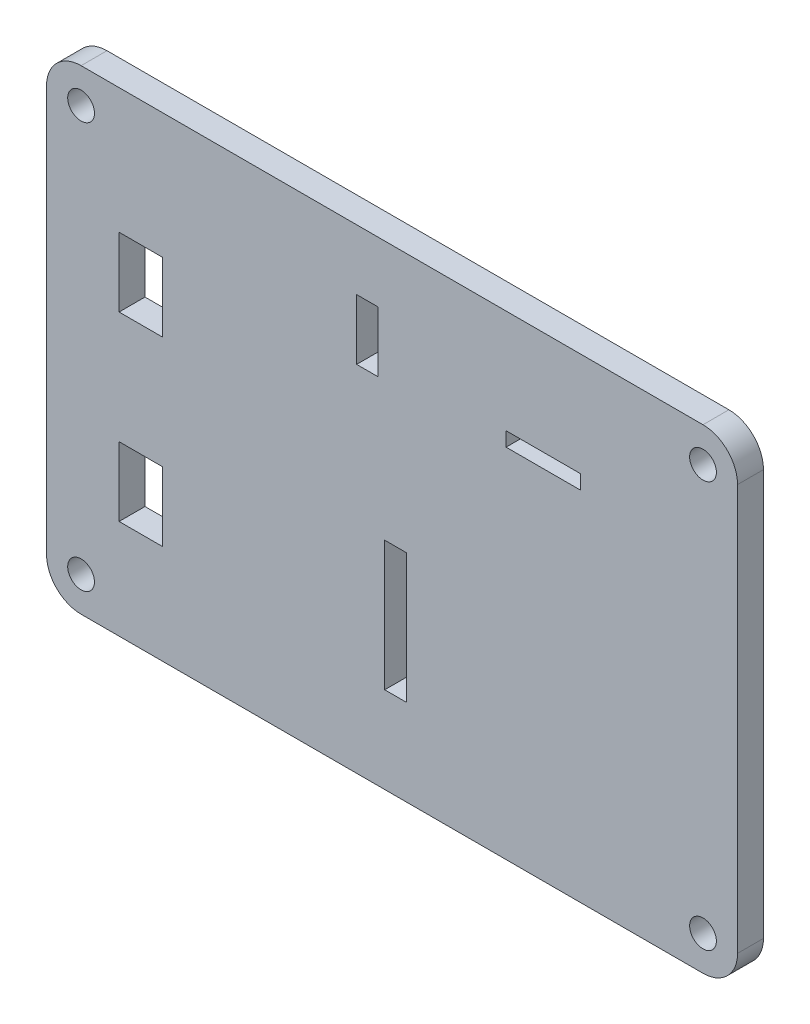
ISO-10303-21;
HEADER;
FILE_DESCRIPTION(('STEP AP214'),'2;1');
FILE_NAME('part.step','',(''),(''),'','','');
FILE_SCHEMA(('AUTOMOTIVE_DESIGN { 1 0 10303 214 1 1 1 1 }'));
ENDSEC;
DATA;
#1=APPLICATION_CONTEXT('core data for automotive mechanical design processes');
#2=APPLICATION_PROTOCOL_DEFINITION('international standard','automotive_design',2000,#1);
#3=PRODUCT_CONTEXT('',#1,'mechanical');
#4=PRODUCT('Part','Part','',(#3));
#5=PRODUCT_RELATED_PRODUCT_CATEGORY('part','',(#4));
#6=PRODUCT_DEFINITION_FORMATION('','',#4);
#7=PRODUCT_DEFINITION_CONTEXT('part definition',#1,'design');
#8=PRODUCT_DEFINITION('design','',#6,#7);
#9=PRODUCT_DEFINITION_SHAPE('','',#8);
#10=(LENGTH_UNIT() NAMED_UNIT(*) SI_UNIT(.MILLI.,.METRE.));
#11=(NAMED_UNIT(*) PLANE_ANGLE_UNIT() SI_UNIT($,.RADIAN.));
#12=(NAMED_UNIT(*) SI_UNIT($,.STERADIAN.) SOLID_ANGLE_UNIT());
#13=UNCERTAINTY_MEASURE_WITH_UNIT(LENGTH_MEASURE(1.E-05),#10,'distance_accuracy_value','');
#14=(GEOMETRIC_REPRESENTATION_CONTEXT(3) GLOBAL_UNCERTAINTY_ASSIGNED_CONTEXT((#13)) GLOBAL_UNIT_ASSIGNED_CONTEXT((#10,
#11,#12)) REPRESENTATION_CONTEXT('',''));
#15=CARTESIAN_POINT('',(0.,0.,0.));
#16=DIRECTION('',(0.,0.,1.));
#17=DIRECTION('',(1.,0.,0.));
#18=AXIS2_PLACEMENT_3D('',#15,#16,#17);
#19=CARTESIAN_POINT('',(-36.,23.5,3.));
#20=DIRECTION('',(0.,0.,1.));
#21=DIRECTION('',(1.,0.,0.));
#22=AXIS2_PLACEMENT_3D('',#19,#20,#21);
#23=PLANE('',#22);
#24=CARTESIAN_POINT('',(36.,-23.5,3.));
#25=DIRECTION('',(0.,0.,1.));
#26=DIRECTION('',(1.,0.,0.));
#27=AXIS2_PLACEMENT_3D('',#24,#25,#26);
#28=CIRCLE('',#27,1.54999999999994);
#29=CARTESIAN_POINT('',(37.55,-23.5,3.));
#30=VERTEX_POINT('',#29);
#31=EDGE_CURVE('E384',#30,#30,#28,.T.);
#32=ORIENTED_EDGE('',*,*,#31,.F.);
#33=EDGE_LOOP('',(#32));
#34=FACE_BOUND('',#33,.T.);
#35=CARTESIAN_POINT('',(-36.,23.5,3.));
#36=DIRECTION('',(0.,0.,1.));
#37=DIRECTION('',(1.,0.,0.));
#38=AXIS2_PLACEMENT_3D('',#35,#36,#37);
#39=CIRCLE('',#38,1.54999999999994);
#40=CARTESIAN_POINT('',(-34.4500000000001,23.5,3.));
#41=VERTEX_POINT('',#40);
#42=EDGE_CURVE('E396',#41,#41,#39,.T.);
#43=ORIENTED_EDGE('',*,*,#42,.F.);
#44=EDGE_LOOP('',(#43));
#45=FACE_BOUND('',#44,.T.);
#46=CARTESIAN_POINT('',(-36.,23.5,3.));
#47=DIRECTION('',(0.,0.,1.));
#48=DIRECTION('',(1.,0.,0.));
#49=AXIS2_PLACEMENT_3D('',#46,#47,#48);
#50=CIRCLE('',#49,4.);
#51=CARTESIAN_POINT('',(-36.,27.5,3.));
#52=VERTEX_POINT('',#51);
#53=CARTESIAN_POINT('',(-40.,23.5,3.));
#54=VERTEX_POINT('',#53);
#55=EDGE_CURVE('E402',#52,#54,#50,.T.);
#56=ORIENTED_EDGE('',*,*,#55,.T.);
#57=DIRECTION('',(0.,-1.,0.));
#58=VECTOR('',#57,1.);
#59=CARTESIAN_POINT('',(-40.,23.5,3.));
#60=LINE('',#59,#58);
#61=CARTESIAN_POINT('',(-40.,-23.5,3.));
#62=VERTEX_POINT('',#61);
#63=EDGE_CURVE('E405',#54,#62,#60,.T.);
#64=ORIENTED_EDGE('',*,*,#63,.T.);
#65=CARTESIAN_POINT('',(-36.,-23.5,3.));
#66=DIRECTION('',(0.,0.,1.));
#67=DIRECTION('',(1.,0.,0.));
#68=AXIS2_PLACEMENT_3D('',#65,#66,#67);
#69=CIRCLE('',#68,4.);
#70=CARTESIAN_POINT('',(-36.,-27.5,3.));
#71=VERTEX_POINT('',#70);
#72=EDGE_CURVE('E408',#62,#71,#69,.T.);
#73=ORIENTED_EDGE('',*,*,#72,.T.);
#74=DIRECTION('',(1.,0.,0.));
#75=VECTOR('',#74,1.);
#76=CARTESIAN_POINT('',(-36.,-27.5,3.));
#77=LINE('',#76,#75);
#78=CARTESIAN_POINT('',(36.,-27.5,3.));
#79=VERTEX_POINT('',#78);
#80=EDGE_CURVE('E410',#71,#79,#77,.T.);
#81=ORIENTED_EDGE('',*,*,#80,.T.);
#82=CARTESIAN_POINT('',(36.,-23.5,3.));
#83=DIRECTION('',(0.,0.,1.));
#84=DIRECTION('',(1.,0.,0.));
#85=AXIS2_PLACEMENT_3D('',#82,#83,#84);
#86=CIRCLE('',#85,4.00000000000001);
#87=CARTESIAN_POINT('',(40.,-23.5,3.));
#88=VERTEX_POINT('',#87);
#89=EDGE_CURVE('E412',#79,#88,#86,.T.);
#90=ORIENTED_EDGE('',*,*,#89,.T.);
#91=DIRECTION('',(0.,1.,0.));
#92=VECTOR('',#91,1.);
#93=CARTESIAN_POINT('',(40.,-23.5,3.));
#94=LINE('',#93,#92);
#95=CARTESIAN_POINT('',(40.,23.5,3.));
#96=VERTEX_POINT('',#95);
#97=EDGE_CURVE('E414',#88,#96,#94,.T.);
#98=ORIENTED_EDGE('',*,*,#97,.T.);
#99=CARTESIAN_POINT('',(36.,23.5,3.));
#100=DIRECTION('',(0.,0.,1.));
#101=DIRECTION('',(1.,0.,0.));
#102=AXIS2_PLACEMENT_3D('',#99,#100,#101);
#103=CIRCLE('',#102,4.);
#104=CARTESIAN_POINT('',(36.,27.5,3.));
#105=VERTEX_POINT('',#104);
#106=EDGE_CURVE('E416',#96,#105,#103,.T.);
#107=ORIENTED_EDGE('',*,*,#106,.T.);
#108=DIRECTION('',(-1.,0.,0.));
#109=VECTOR('',#108,1.);
#110=CARTESIAN_POINT('',(36.,27.5,3.));
#111=LINE('',#110,#109);
#112=EDGE_CURVE('E418',#105,#52,#111,.T.);
#113=ORIENTED_EDGE('',*,*,#112,.T.);
#114=EDGE_LOOP('',(#56,#64,#73,#81,#90,#98,#107,#113));
#115=FACE_BOUND('',#114,.T.);
#116=CARTESIAN_POINT('',(-36.,-23.5,3.));
#117=DIRECTION('',(0.,0.,1.));
#118=DIRECTION('',(1.,0.,0.));
#119=AXIS2_PLACEMENT_3D('',#116,#117,#118);
#120=CIRCLE('',#119,1.54999999999994);
#121=CARTESIAN_POINT('',(-34.4500000000001,-23.5,3.));
#122=VERTEX_POINT('',#121);
#123=EDGE_CURVE('E390',#122,#122,#120,.T.);
#124=ORIENTED_EDGE('',*,*,#123,.F.);
#125=EDGE_LOOP('',(#124));
#126=FACE_BOUND('',#125,.T.);
#127=CARTESIAN_POINT('',(36.,23.5,3.));
#128=DIRECTION('',(0.,0.,1.));
#129=DIRECTION('',(1.,0.,0.));
#130=AXIS2_PLACEMENT_3D('',#127,#128,#129);
#131=CIRCLE('',#130,1.54999999999994);
#132=CARTESIAN_POINT('',(37.55,23.5,3.));
#133=VERTEX_POINT('',#132);
#134=EDGE_CURVE('E378',#133,#133,#131,.T.);
#135=ORIENTED_EDGE('',*,*,#134,.F.);
#136=EDGE_LOOP('',(#135));
#137=FACE_BOUND('',#136,.T.);
#138=DIRECTION('',(-1.,0.,0.));
#139=VECTOR('',#138,1.);
#140=CARTESIAN_POINT('',(-26.6,-8.00000000000001,3.));
#141=LINE('',#140,#139);
#142=CARTESIAN_POINT('',(-26.6,-8.00000000000001,3.));
#143=VERTEX_POINT('',#142);
#144=CARTESIAN_POINT('',(-31.599999999999,-8.00000000000001,3.));
#145=VERTEX_POINT('',#144);
#146=EDGE_CURVE('E349',#143,#145,#141,.T.);
#147=ORIENTED_EDGE('',*,*,#146,.F.);
#148=DIRECTION('',(0.,1.,0.));
#149=VECTOR('',#148,1.);
#150=CARTESIAN_POINT('',(-26.6,-16.,3.));
#151=LINE('',#150,#149);
#152=CARTESIAN_POINT('',(-26.6,-16.,3.));
#153=VERTEX_POINT('',#152);
#154=EDGE_CURVE('E347',#153,#143,#151,.T.);
#155=ORIENTED_EDGE('',*,*,#154,.F.);
#156=DIRECTION('',(1.,0.,0.));
#157=VECTOR('',#156,1.);
#158=CARTESIAN_POINT('',(-31.599999999999,-16.,3.));
#159=LINE('',#158,#157);
#160=CARTESIAN_POINT('',(-31.599999999999,-16.,3.));
#161=VERTEX_POINT('',#160);
#162=EDGE_CURVE('E355',#161,#153,#159,.T.);
#163=ORIENTED_EDGE('',*,*,#162,.F.);
#164=DIRECTION('',(0.,-1.,0.));
#165=VECTOR('',#164,1.);
#166=CARTESIAN_POINT('',(-31.599999999999,-8.00000000000001,3.));
#167=LINE('',#166,#165);
#168=EDGE_CURVE('E352',#145,#161,#167,.T.);
#169=ORIENTED_EDGE('',*,*,#168,.F.);
#170=EDGE_LOOP('',(#147,#155,#163,#169));
#171=FACE_BOUND('',#170,.T.);
#172=DIRECTION('',(0.,1.,0.));
#173=VECTOR('',#172,1.);
#174=CARTESIAN_POINT('',(-26.6,5.,3.));
#175=LINE('',#174,#173);
#176=CARTESIAN_POINT('',(-26.6,5.,3.));
#177=VERTEX_POINT('',#176);
#178=CARTESIAN_POINT('',(-26.6,13.,3.));
#179=VERTEX_POINT('',#178);
#180=EDGE_CURVE('E318',#177,#179,#175,.T.);
#181=ORIENTED_EDGE('',*,*,#180,.F.);
#182=DIRECTION('',(1.,0.,0.));
#183=VECTOR('',#182,1.);
#184=CARTESIAN_POINT('',(-31.599999999999,5.,3.));
#185=LINE('',#184,#183);
#186=CARTESIAN_POINT('',(-31.599999999999,5.,3.));
#187=VERTEX_POINT('',#186);
#188=EDGE_CURVE('E316',#187,#177,#185,.T.);
#189=ORIENTED_EDGE('',*,*,#188,.F.);
#190=DIRECTION('',(0.,-1.,0.));
#191=VECTOR('',#190,1.);
#192=CARTESIAN_POINT('',(-31.599999999999,13.,3.));
#193=LINE('',#192,#191);
#194=CARTESIAN_POINT('',(-31.599999999999,13.,3.));
#195=VERTEX_POINT('',#194);
#196=EDGE_CURVE('E324',#195,#187,#193,.T.);
#197=ORIENTED_EDGE('',*,*,#196,.F.);
#198=DIRECTION('',(-1.,0.,0.));
#199=VECTOR('',#198,1.);
#200=CARTESIAN_POINT('',(-26.6,13.,3.));
#201=LINE('',#200,#199);
#202=EDGE_CURVE('E321',#179,#195,#201,.T.);
#203=ORIENTED_EDGE('',*,*,#202,.F.);
#204=EDGE_LOOP('',(#181,#189,#197,#203));
#205=FACE_BOUND('',#204,.T.);
#206=DIRECTION('',(0.,1.,0.));
#207=VECTOR('',#206,1.);
#208=CARTESIAN_POINT('',(1.65000000000015,-17.5,3.));
#209=LINE('',#208,#207);
#210=CARTESIAN_POINT('',(1.65000000000015,-17.5,3.));
#211=VERTEX_POINT('',#210);
#212=CARTESIAN_POINT('',(1.65000000000015,-2.50000000000006,3.));
#213=VERTEX_POINT('',#212);
#214=EDGE_CURVE('E287',#211,#213,#209,.T.);
#215=ORIENTED_EDGE('',*,*,#214,.F.);
#216=DIRECTION('',(1.,0.,0.));
#217=VECTOR('',#216,1.);
#218=CARTESIAN_POINT('',(-0.850000000000017,-17.5,3.));
#219=LINE('',#218,#217);
#220=CARTESIAN_POINT('',(-0.850000000000017,-17.5,3.));
#221=VERTEX_POINT('',#220);
#222=EDGE_CURVE('E285',#221,#211,#219,.T.);
#223=ORIENTED_EDGE('',*,*,#222,.F.);
#224=DIRECTION('',(0.,-1.,0.));
#225=VECTOR('',#224,1.);
#226=CARTESIAN_POINT('',(-0.850000000000019,-2.50000000000006,3.));
#227=LINE('',#226,#225);
#228=CARTESIAN_POINT('',(-0.850000000000014,-2.50000000000006,3.));
#229=VERTEX_POINT('',#228);
#230=EDGE_CURVE('E293',#229,#221,#227,.T.);
#231=ORIENTED_EDGE('',*,*,#230,.F.);
#232=DIRECTION('',(-1.,0.,0.));
#233=VECTOR('',#232,1.);
#234=CARTESIAN_POINT('',(1.65000000000015,-2.50000000000006,3.));
#235=LINE('',#234,#233);
#236=EDGE_CURVE('E290',#213,#229,#235,.T.);
#237=ORIENTED_EDGE('',*,*,#236,.F.);
#238=EDGE_LOOP('',(#215,#223,#231,#237));
#239=FACE_BOUND('',#238,.T.);
#240=DIRECTION('',(0.,1.,0.));
#241=VECTOR('',#240,1.);
#242=CARTESIAN_POINT('',(-1.60000000000005,13.5,3.));
#243=LINE('',#242,#241);
#244=CARTESIAN_POINT('',(-1.60000000000005,13.5,3.));
#245=VERTEX_POINT('',#244);
#246=CARTESIAN_POINT('',(-1.60000000000005,20.5,3.));
#247=VERTEX_POINT('',#246);
#248=EDGE_CURVE('E256',#245,#247,#243,.T.);
#249=ORIENTED_EDGE('',*,*,#248,.F.);
#250=DIRECTION('',(1.,0.,0.));
#251=VECTOR('',#250,1.);
#252=CARTESIAN_POINT('',(-4.09999999999999,13.5,3.));
#253=LINE('',#252,#251);
#254=CARTESIAN_POINT('',(-4.09999999999999,13.5,3.));
#255=VERTEX_POINT('',#254);
#256=EDGE_CURVE('E254',#255,#245,#253,.T.);
#257=ORIENTED_EDGE('',*,*,#256,.F.);
#258=DIRECTION('',(0.,-1.,0.));
#259=VECTOR('',#258,1.);
#260=CARTESIAN_POINT('',(-4.09999999999999,20.5,3.));
#261=LINE('',#260,#259);
#262=CARTESIAN_POINT('',(-4.09999999999999,20.5,3.));
#263=VERTEX_POINT('',#262);
#264=EDGE_CURVE('E262',#263,#255,#261,.T.);
#265=ORIENTED_EDGE('',*,*,#264,.F.);
#266=DIRECTION('',(-1.,0.,0.));
#267=VECTOR('',#266,1.);
#268=CARTESIAN_POINT('',(-1.60000000000005,20.5,3.));
#269=LINE('',#268,#267);
#270=EDGE_CURVE('E259',#247,#263,#269,.T.);
#271=ORIENTED_EDGE('',*,*,#270,.F.);
#272=EDGE_LOOP('',(#249,#257,#265,#271));
#273=FACE_BOUND('',#272,.T.);
#274=DIRECTION('',(-1.,0.,0.));
#275=VECTOR('',#274,1.);
#276=CARTESIAN_POINT('',(21.7999999999998,15.4999999999998,3.));
#277=LINE('',#276,#275);
#278=CARTESIAN_POINT('',(21.7999999999998,15.4999999999998,3.));
#279=VERTEX_POINT('',#278);
#280=CARTESIAN_POINT('',(13.2000000000001,15.4999999999998,3.));
#281=VERTEX_POINT('',#280);
#282=EDGE_CURVE('E226',#279,#281,#277,.T.);
#283=ORIENTED_EDGE('',*,*,#282,.F.);
#284=DIRECTION('',(0.,1.,0.));
#285=VECTOR('',#284,1.);
#286=CARTESIAN_POINT('',(21.7999999999998,13.85,3.));
#287=LINE('',#286,#285);
#288=CARTESIAN_POINT('',(21.7999999999998,13.85,3.));
#289=VERTEX_POINT('',#288);
#290=EDGE_CURVE('E218',#289,#279,#287,.T.);
#291=ORIENTED_EDGE('',*,*,#290,.F.);
#292=DIRECTION('',(1.,0.,0.));
#293=VECTOR('',#292,1.);
#294=CARTESIAN_POINT('',(13.1999999999999,13.85,3.));
#295=LINE('',#294,#293);
#296=CARTESIAN_POINT('',(13.1999999999999,13.85,3.));
#297=VERTEX_POINT('',#296);
#298=EDGE_CURVE('E240',#297,#289,#295,.T.);
#299=ORIENTED_EDGE('',*,*,#298,.F.);
#300=DIRECTION('',(-1.34572487833367E-13,-1.,0.));
#301=VECTOR('',#300,1.);
#302=CARTESIAN_POINT('',(13.2000000000001,15.4999999999998,3.));
#303=LINE('',#302,#301);
#304=EDGE_CURVE('E238',#281,#297,#303,.T.);
#305=ORIENTED_EDGE('',*,*,#304,.F.);
#306=EDGE_LOOP('',(#283,#291,#299,#305));
#307=FACE_BOUND('',#306,.T.);
#308=ADVANCED_FACE('F33',(#34,#45,#115,#126,#137,#171,#205,#239,#273,#307),#23,.T.);
#309=CARTESIAN_POINT('',(-36.,23.5,0.));
#310=DIRECTION('',(0.,0.,1.));
#311=DIRECTION('',(1.,0.,0.));
#312=AXIS2_PLACEMENT_3D('',#309,#310,#311);
#313=PLANE('',#312);
#314=DIRECTION('',(1.,0.,0.));
#315=VECTOR('',#314,1.);
#316=CARTESIAN_POINT('',(-4.09999999999999,13.5,0.));
#317=LINE('',#316,#315);
#318=CARTESIAN_POINT('',(-4.09999999999999,13.5,0.));
#319=VERTEX_POINT('',#318);
#320=CARTESIAN_POINT('',(-1.60000000000005,13.5,0.));
#321=VERTEX_POINT('',#320);
#322=EDGE_CURVE('E234',#319,#321,#317,.T.);
#323=ORIENTED_EDGE('',*,*,#322,.T.);
#324=DIRECTION('',(0.,1.,0.));
#325=VECTOR('',#324,1.);
#326=CARTESIAN_POINT('',(-1.60000000000005,13.5,0.));
#327=LINE('',#326,#325);
#328=CARTESIAN_POINT('',(-1.60000000000005,20.5,0.));
#329=VERTEX_POINT('',#328);
#330=EDGE_CURVE('E267',#321,#329,#327,.T.);
#331=ORIENTED_EDGE('',*,*,#330,.T.);
#332=DIRECTION('',(-1.,0.,0.));
#333=VECTOR('',#332,1.);
#334=CARTESIAN_POINT('',(-1.60000000000005,20.5,0.));
#335=LINE('',#334,#333);
#336=CARTESIAN_POINT('',(-4.09999999999999,20.5,0.));
#337=VERTEX_POINT('',#336);
#338=EDGE_CURVE('E270',#329,#337,#335,.T.);
#339=ORIENTED_EDGE('',*,*,#338,.T.);
#340=DIRECTION('',(0.,-1.,0.));
#341=VECTOR('',#340,1.);
#342=CARTESIAN_POINT('',(-4.09999999999999,20.5,0.));
#343=LINE('',#342,#341);
#344=EDGE_CURVE('E257',#337,#319,#343,.T.);
#345=ORIENTED_EDGE('',*,*,#344,.T.);
#346=EDGE_LOOP('',(#323,#331,#339,#345));
#347=FACE_BOUND('',#346,.T.);
#348=DIRECTION('',(1.,0.,0.));
#349=VECTOR('',#348,1.);
#350=CARTESIAN_POINT('',(-31.599999999999,5.,0.));
#351=LINE('',#350,#349);
#352=CARTESIAN_POINT('',(-31.599999999999,5.,0.));
#353=VERTEX_POINT('',#352);
#354=CARTESIAN_POINT('',(-26.6,5.,0.));
#355=VERTEX_POINT('',#354);
#356=EDGE_CURVE('E315',#353,#355,#351,.T.);
#357=ORIENTED_EDGE('',*,*,#356,.T.);
#358=DIRECTION('',(0.,1.,0.));
#359=VECTOR('',#358,1.);
#360=CARTESIAN_POINT('',(-26.6,5.,0.));
#361=LINE('',#360,#359);
#362=CARTESIAN_POINT('',(-26.6,13.,0.));
#363=VERTEX_POINT('',#362);
#364=EDGE_CURVE('E329',#355,#363,#361,.T.);
#365=ORIENTED_EDGE('',*,*,#364,.T.);
#366=DIRECTION('',(-1.,0.,0.));
#367=VECTOR('',#366,1.);
#368=CARTESIAN_POINT('',(-26.6,13.,0.));
#369=LINE('',#368,#367);
#370=CARTESIAN_POINT('',(-31.599999999999,13.,0.));
#371=VERTEX_POINT('',#370);
#372=EDGE_CURVE('E332',#363,#371,#369,.T.);
#373=ORIENTED_EDGE('',*,*,#372,.T.);
#374=DIRECTION('',(0.,-1.,0.));
#375=VECTOR('',#374,1.);
#376=CARTESIAN_POINT('',(-31.599999999999,13.,0.));
#377=LINE('',#376,#375);
#378=EDGE_CURVE('E319',#371,#353,#377,.T.);
#379=ORIENTED_EDGE('',*,*,#378,.T.);
#380=EDGE_LOOP('',(#357,#365,#373,#379));
#381=FACE_BOUND('',#380,.T.);
#382=CARTESIAN_POINT('',(36.,23.5,0.));
#383=DIRECTION('',(0.,0.,1.));
#384=DIRECTION('',(1.,0.,0.));
#385=AXIS2_PLACEMENT_3D('',#382,#383,#384);
#386=CIRCLE('',#385,1.54999999999994);
#387=CARTESIAN_POINT('',(37.55,23.5,0.));
#388=VERTEX_POINT('',#387);
#389=EDGE_CURVE('E377',#388,#388,#386,.T.);
#390=ORIENTED_EDGE('',*,*,#389,.T.);
#391=EDGE_LOOP('',(#390));
#392=FACE_BOUND('',#391,.T.);
#393=CARTESIAN_POINT('',(36.,-23.5,0.));
#394=DIRECTION('',(0.,0.,1.));
#395=DIRECTION('',(1.,0.,0.));
#396=AXIS2_PLACEMENT_3D('',#393,#394,#395);
#397=CIRCLE('',#396,1.54999999999994);
#398=CARTESIAN_POINT('',(37.55,-23.5,0.));
#399=VERTEX_POINT('',#398);
#400=EDGE_CURVE('E381',#399,#399,#397,.T.);
#401=ORIENTED_EDGE('',*,*,#400,.T.);
#402=EDGE_LOOP('',(#401));
#403=FACE_BOUND('',#402,.T.);
#404=CARTESIAN_POINT('',(-36.,-23.5,0.));
#405=DIRECTION('',(0.,0.,1.));
#406=DIRECTION('',(1.,0.,0.));
#407=AXIS2_PLACEMENT_3D('',#404,#405,#406);
#408=CIRCLE('',#407,1.54999999999994);
#409=CARTESIAN_POINT('',(-34.4500000000001,-23.5,0.));
#410=VERTEX_POINT('',#409);
#411=EDGE_CURVE('E387',#410,#410,#408,.T.);
#412=ORIENTED_EDGE('',*,*,#411,.T.);
#413=EDGE_LOOP('',(#412));
#414=FACE_BOUND('',#413,.T.);
#415=CARTESIAN_POINT('',(-36.,23.5,0.));
#416=DIRECTION('',(0.,0.,1.));
#417=DIRECTION('',(1.,0.,0.));
#418=AXIS2_PLACEMENT_3D('',#415,#416,#417);
#419=CIRCLE('',#418,1.54999999999994);
#420=CARTESIAN_POINT('',(-34.4500000000001,23.5,0.));
#421=VERTEX_POINT('',#420);
#422=EDGE_CURVE('E393',#421,#421,#419,.T.);
#423=ORIENTED_EDGE('',*,*,#422,.T.);
#424=EDGE_LOOP('',(#423));
#425=FACE_BOUND('',#424,.T.);
#426=CARTESIAN_POINT('',(-36.,23.5,0.));
#427=DIRECTION('',(0.,0.,1.));
#428=DIRECTION('',(1.,0.,0.));
#429=AXIS2_PLACEMENT_3D('',#426,#427,#428);
#430=CIRCLE('',#429,4.);
#431=CARTESIAN_POINT('',(-36.,27.5,0.));
#432=VERTEX_POINT('',#431);
#433=CARTESIAN_POINT('',(-40.,23.5,0.));
#434=VERTEX_POINT('',#433);
#435=EDGE_CURVE('E399',#432,#434,#430,.T.);
#436=ORIENTED_EDGE('',*,*,#435,.F.);
#437=DIRECTION('',(-1.,0.,0.));
#438=VECTOR('',#437,1.);
#439=CARTESIAN_POINT('',(36.,27.5,0.));
#440=LINE('',#439,#438);
#441=CARTESIAN_POINT('',(36.,27.5,0.));
#442=VERTEX_POINT('',#441);
#443=EDGE_CURVE('E406',#442,#432,#440,.T.);
#444=ORIENTED_EDGE('',*,*,#443,.F.);
#445=CARTESIAN_POINT('',(36.,23.5,0.));
#446=DIRECTION('',(0.,0.,1.));
#447=DIRECTION('',(1.,0.,0.));
#448=AXIS2_PLACEMENT_3D('',#445,#446,#447);
#449=CIRCLE('',#448,4.);
#450=CARTESIAN_POINT('',(40.,23.5,0.));
#451=VERTEX_POINT('',#450);
#452=EDGE_CURVE('E433',#451,#442,#449,.T.);
#453=ORIENTED_EDGE('',*,*,#452,.F.);
#454=DIRECTION('',(0.,1.,0.));
#455=VECTOR('',#454,1.);
#456=CARTESIAN_POINT('',(40.,-23.5,0.));
#457=LINE('',#456,#455);
#458=CARTESIAN_POINT('',(40.,-23.5,0.));
#459=VERTEX_POINT('',#458);
#460=EDGE_CURVE('E431',#459,#451,#457,.T.);
#461=ORIENTED_EDGE('',*,*,#460,.F.);
#462=CARTESIAN_POINT('',(36.,-23.5,0.));
#463=DIRECTION('',(0.,0.,1.));
#464=DIRECTION('',(1.,0.,0.));
#465=AXIS2_PLACEMENT_3D('',#462,#463,#464);
#466=CIRCLE('',#465,4.00000000000001);
#467=CARTESIAN_POINT('',(36.,-27.5,0.));
#468=VERTEX_POINT('',#467);
#469=EDGE_CURVE('E429',#468,#459,#466,.T.);
#470=ORIENTED_EDGE('',*,*,#469,.F.);
#471=DIRECTION('',(1.,0.,0.));
#472=VECTOR('',#471,1.);
#473=CARTESIAN_POINT('',(-36.,-27.5,0.));
#474=LINE('',#473,#472);
#475=CARTESIAN_POINT('',(-36.,-27.5,0.));
#476=VERTEX_POINT('',#475);
#477=EDGE_CURVE('E427',#476,#468,#474,.T.);
#478=ORIENTED_EDGE('',*,*,#477,.F.);
#479=CARTESIAN_POINT('',(-36.,-23.5,0.));
#480=DIRECTION('',(0.,0.,1.));
#481=DIRECTION('',(1.,0.,0.));
#482=AXIS2_PLACEMENT_3D('',#479,#480,#481);
#483=CIRCLE('',#482,4.);
#484=CARTESIAN_POINT('',(-40.,-23.5,0.));
#485=VERTEX_POINT('',#484);
#486=EDGE_CURVE('E425',#485,#476,#483,.T.);
#487=ORIENTED_EDGE('',*,*,#486,.F.);
#488=DIRECTION('',(0.,-1.,0.));
#489=VECTOR('',#488,1.);
#490=CARTESIAN_POINT('',(-40.,23.5,0.));
#491=LINE('',#490,#489);
#492=EDGE_CURVE('E423',#434,#485,#491,.T.);
#493=ORIENTED_EDGE('',*,*,#492,.F.);
#494=EDGE_LOOP('',(#436,#444,#453,#461,#470,#478,#487,#493));
#495=FACE_BOUND('',#494,.T.);
#496=DIRECTION('',(0.,1.,0.));
#497=VECTOR('',#496,1.);
#498=CARTESIAN_POINT('',(-26.6,-16.,0.));
#499=LINE('',#498,#497);
#500=CARTESIAN_POINT('',(-26.6,-16.,0.));
#501=VERTEX_POINT('',#500);
#502=CARTESIAN_POINT('',(-26.6,-8.00000000000001,0.));
#503=VERTEX_POINT('',#502);
#504=EDGE_CURVE('E346',#501,#503,#499,.T.);
#505=ORIENTED_EDGE('',*,*,#504,.T.);
#506=DIRECTION('',(-1.,0.,0.));
#507=VECTOR('',#506,1.);
#508=CARTESIAN_POINT('',(-26.6,-8.00000000000001,0.));
#509=LINE('',#508,#507);
#510=CARTESIAN_POINT('',(-31.599999999999,-8.00000000000001,0.));
#511=VERTEX_POINT('',#510);
#512=EDGE_CURVE('E360',#503,#511,#509,.T.);
#513=ORIENTED_EDGE('',*,*,#512,.T.);
#514=DIRECTION('',(0.,-1.,0.));
#515=VECTOR('',#514,1.);
#516=CARTESIAN_POINT('',(-31.599999999999,-8.00000000000001,0.));
#517=LINE('',#516,#515);
#518=CARTESIAN_POINT('',(-31.599999999999,-16.,0.));
#519=VERTEX_POINT('',#518);
#520=EDGE_CURVE('E363',#511,#519,#517,.T.);
#521=ORIENTED_EDGE('',*,*,#520,.T.);
#522=DIRECTION('',(1.,0.,0.));
#523=VECTOR('',#522,1.);
#524=CARTESIAN_POINT('',(-31.599999999999,-16.,0.));
#525=LINE('',#524,#523);
#526=EDGE_CURVE('E350',#519,#501,#525,.T.);
#527=ORIENTED_EDGE('',*,*,#526,.T.);
#528=EDGE_LOOP('',(#505,#513,#521,#527));
#529=FACE_BOUND('',#528,.T.);
#530=DIRECTION('',(1.,0.,0.));
#531=VECTOR('',#530,1.);
#532=CARTESIAN_POINT('',(-0.850000000000017,-17.5,0.));
#533=LINE('',#532,#531);
#534=CARTESIAN_POINT('',(-0.850000000000012,-17.5,0.));
#535=VERTEX_POINT('',#534);
#536=CARTESIAN_POINT('',(1.65000000000015,-17.5,0.));
#537=VERTEX_POINT('',#536);
#538=EDGE_CURVE('E284',#535,#537,#533,.T.);
#539=ORIENTED_EDGE('',*,*,#538,.T.);
#540=DIRECTION('',(0.,1.,0.));
#541=VECTOR('',#540,1.);
#542=CARTESIAN_POINT('',(1.65000000000015,-17.5,0.));
#543=LINE('',#542,#541);
#544=CARTESIAN_POINT('',(1.65000000000015,-2.50000000000006,0.));
#545=VERTEX_POINT('',#544);
#546=EDGE_CURVE('E298',#537,#545,#543,.T.);
#547=ORIENTED_EDGE('',*,*,#546,.T.);
#548=DIRECTION('',(-1.,0.,0.));
#549=VECTOR('',#548,1.);
#550=CARTESIAN_POINT('',(1.65000000000015,-2.50000000000006,0.));
#551=LINE('',#550,#549);
#552=CARTESIAN_POINT('',(-0.850000000000019,-2.50000000000006,0.));
#553=VERTEX_POINT('',#552);
#554=EDGE_CURVE('E301',#545,#553,#551,.T.);
#555=ORIENTED_EDGE('',*,*,#554,.T.);
#556=DIRECTION('',(0.,-1.,0.));
#557=VECTOR('',#556,1.);
#558=CARTESIAN_POINT('',(-0.850000000000019,-2.50000000000006,0.));
#559=LINE('',#558,#557);
#560=EDGE_CURVE('E288',#553,#535,#559,.T.);
#561=ORIENTED_EDGE('',*,*,#560,.T.);
#562=EDGE_LOOP('',(#539,#547,#555,#561));
#563=FACE_BOUND('',#562,.T.);
#564=DIRECTION('',(0.,1.,0.));
#565=VECTOR('',#564,1.);
#566=CARTESIAN_POINT('',(21.7999999999998,13.85,0.));
#567=LINE('',#566,#565);
#568=CARTESIAN_POINT('',(21.7999999999998,13.85,0.));
#569=VERTEX_POINT('',#568);
#570=CARTESIAN_POINT('',(21.7999999999998,15.4999999999998,0.));
#571=VERTEX_POINT('',#570);
#572=EDGE_CURVE('E56',#569,#571,#567,.T.);
#573=ORIENTED_EDGE('',*,*,#572,.T.);
#574=DIRECTION('',(-1.,0.,0.));
#575=VECTOR('',#574,1.);
#576=CARTESIAN_POINT('',(21.7999999999998,15.4999999999998,0.));
#577=LINE('',#576,#575);
#578=CARTESIAN_POINT('',(13.2000000000001,15.4999999999998,0.));
#579=VERTEX_POINT('',#578);
#580=EDGE_CURVE('E233',#571,#579,#577,.T.);
#581=ORIENTED_EDGE('',*,*,#580,.T.);
#582=DIRECTION('',(-1.34572487833367E-13,-1.,0.));
#583=VECTOR('',#582,1.);
#584=CARTESIAN_POINT('',(13.2000000000001,15.4999999999998,0.));
#585=LINE('',#584,#583);
#586=CARTESIAN_POINT('',(13.1999999999999,13.85,0.));
#587=VERTEX_POINT('',#586);
#588=EDGE_CURVE('E246',#579,#587,#585,.T.);
#589=ORIENTED_EDGE('',*,*,#588,.T.);
#590=DIRECTION('',(1.,0.,0.));
#591=VECTOR('',#590,1.);
#592=CARTESIAN_POINT('',(13.1999999999999,13.85,0.));
#593=LINE('',#592,#591);
#594=EDGE_CURVE('E227',#587,#569,#593,.T.);
#595=ORIENTED_EDGE('',*,*,#594,.T.);
#596=EDGE_LOOP('',(#573,#581,#589,#595));
#597=FACE_BOUND('',#596,.T.);
#598=ADVANCED_FACE('F463',(#347,#381,#392,#403,#414,#425,#495,#529,#563,#597),#313,.F.);
#599=CARTESIAN_POINT('',(-36.,23.5,3.));
#600=DIRECTION('',(0.,0.,-1.));
#601=DIRECTION('',(-1.,0.,0.));
#602=AXIS2_PLACEMENT_3D('',#599,#600,#601);
#603=CYLINDRICAL_SURFACE('',#602,4.);
#604=ORIENTED_EDGE('',*,*,#435,.T.);
#605=DIRECTION('',(0.,0.,-1.));
#606=VECTOR('',#605,1.);
#607=CARTESIAN_POINT('',(-40.,23.5,3.));
#608=LINE('',#607,#606);
#609=EDGE_CURVE('E11',#54,#434,#608,.T.);
#610=ORIENTED_EDGE('',*,*,#609,.F.);
#611=ORIENTED_EDGE('',*,*,#55,.F.);
#612=DIRECTION('',(0.,0.,-1.));
#613=VECTOR('',#612,1.);
#614=CARTESIAN_POINT('',(-36.,27.5,3.));
#615=LINE('',#614,#613);
#616=EDGE_CURVE('E420',#52,#432,#615,.T.);
#617=ORIENTED_EDGE('',*,*,#616,.T.);
#618=EDGE_LOOP('',(#604,#610,#611,#617));
#619=FACE_BOUND('',#618,.T.);
#620=ADVANCED_FACE('F35',(#619),#603,.T.);
#621=CARTESIAN_POINT('',(-40.,23.5,3.));
#622=DIRECTION('',(1.,0.,0.));
#623=DIRECTION('',(0.,1.,0.));
#624=AXIS2_PLACEMENT_3D('',#621,#622,#623);
#625=PLANE('',#624);
#626=ORIENTED_EDGE('',*,*,#492,.T.);
#627=DIRECTION('',(0.,0.,-1.));
#628=VECTOR('',#627,1.);
#629=CARTESIAN_POINT('',(-40.,-23.5,3.));
#630=LINE('',#629,#628);
#631=EDGE_CURVE('E41',#62,#485,#630,.T.);
#632=ORIENTED_EDGE('',*,*,#631,.F.);
#633=ORIENTED_EDGE('',*,*,#63,.F.);
#634=ORIENTED_EDGE('',*,*,#609,.T.);
#635=EDGE_LOOP('',(#626,#632,#633,#634));
#636=FACE_BOUND('',#635,.T.);
#637=ADVANCED_FACE('F481',(#636),#625,.F.);
#638=CARTESIAN_POINT('',(-36.,-23.5,3.));
#639=DIRECTION('',(0.,0.,-1.));
#640=DIRECTION('',(-1.,0.,0.));
#641=AXIS2_PLACEMENT_3D('',#638,#639,#640);
#642=CYLINDRICAL_SURFACE('',#641,4.);
#643=ORIENTED_EDGE('',*,*,#486,.T.);
#644=DIRECTION('',(0.,0.,-1.));
#645=VECTOR('',#644,1.);
#646=CARTESIAN_POINT('',(-36.,-27.5,3.));
#647=LINE('',#646,#645);
#648=EDGE_CURVE('E450',#71,#476,#647,.T.);
#649=ORIENTED_EDGE('',*,*,#648,.F.);
#650=ORIENTED_EDGE('',*,*,#72,.F.);
#651=ORIENTED_EDGE('',*,*,#631,.T.);
#652=EDGE_LOOP('',(#643,#649,#650,#651));
#653=FACE_BOUND('',#652,.T.);
#654=ADVANCED_FACE('F457',(#653),#642,.T.);
#655=CARTESIAN_POINT('',(-36.,-27.5,3.));
#656=DIRECTION('',(0.,1.,0.));
#657=DIRECTION('',(0.,0.,1.));
#658=AXIS2_PLACEMENT_3D('',#655,#656,#657);
#659=PLANE('',#658);
#660=ORIENTED_EDGE('',*,*,#477,.T.);
#661=DIRECTION('',(0.,0.,-1.));
#662=VECTOR('',#661,1.);
#663=CARTESIAN_POINT('',(36.,-27.5,3.));
#664=LINE('',#663,#662);
#665=EDGE_CURVE('E447',#79,#468,#664,.T.);
#666=ORIENTED_EDGE('',*,*,#665,.F.);
#667=ORIENTED_EDGE('',*,*,#80,.F.);
#668=ORIENTED_EDGE('',*,*,#648,.T.);
#669=EDGE_LOOP('',(#660,#666,#667,#668));
#670=FACE_BOUND('',#669,.T.);
#671=ADVANCED_FACE('F469',(#670),#659,.F.);
#672=CARTESIAN_POINT('',(36.,-23.5,3.));
#673=DIRECTION('',(0.,0.,-1.));
#674=DIRECTION('',(-1.,0.,0.));
#675=AXIS2_PLACEMENT_3D('',#672,#673,#674);
#676=CYLINDRICAL_SURFACE('',#675,4.00000000000001);
#677=ORIENTED_EDGE('',*,*,#469,.T.);
#678=DIRECTION('',(0.,0.,-1.));
#679=VECTOR('',#678,1.);
#680=CARTESIAN_POINT('',(40.,-23.5,3.));
#681=LINE('',#680,#679);
#682=EDGE_CURVE('E444',#88,#459,#681,.T.);
#683=ORIENTED_EDGE('',*,*,#682,.F.);
#684=ORIENTED_EDGE('',*,*,#89,.F.);
#685=ORIENTED_EDGE('',*,*,#665,.T.);
#686=EDGE_LOOP('',(#677,#683,#684,#685));
#687=FACE_BOUND('',#686,.T.);
#688=ADVANCED_FACE('F473',(#687),#676,.T.);
#689=CARTESIAN_POINT('',(40.,-23.5,3.));
#690=DIRECTION('',(-1.,0.,0.));
#691=DIRECTION('',(0.,0.,1.));
#692=AXIS2_PLACEMENT_3D('',#689,#690,#691);
#693=PLANE('',#692);
#694=ORIENTED_EDGE('',*,*,#460,.T.);
#695=DIRECTION('',(0.,0.,-1.));
#696=VECTOR('',#695,1.);
#697=CARTESIAN_POINT('',(40.,23.5,3.));
#698=LINE('',#697,#696);
#699=EDGE_CURVE('E441',#96,#451,#698,.T.);
#700=ORIENTED_EDGE('',*,*,#699,.F.);
#701=ORIENTED_EDGE('',*,*,#97,.F.);
#702=ORIENTED_EDGE('',*,*,#682,.T.);
#703=EDGE_LOOP('',(#694,#700,#701,#702));
#704=FACE_BOUND('',#703,.T.);
#705=ADVANCED_FACE('F494',(#704),#693,.F.);
#706=CARTESIAN_POINT('',(36.,23.5,3.));
#707=DIRECTION('',(0.,0.,-1.));
#708=DIRECTION('',(-1.,0.,0.));
#709=AXIS2_PLACEMENT_3D('',#706,#707,#708);
#710=CYLINDRICAL_SURFACE('',#709,4.);
#711=ORIENTED_EDGE('',*,*,#452,.T.);
#712=DIRECTION('',(0.,0.,-1.));
#713=VECTOR('',#712,1.);
#714=CARTESIAN_POINT('',(36.,27.5,3.));
#715=LINE('',#714,#713);
#716=EDGE_CURVE('E438',#105,#442,#715,.T.);
#717=ORIENTED_EDGE('',*,*,#716,.F.);
#718=ORIENTED_EDGE('',*,*,#106,.F.);
#719=ORIENTED_EDGE('',*,*,#699,.T.);
#720=EDGE_LOOP('',(#711,#717,#718,#719));
#721=FACE_BOUND('',#720,.T.);
#722=ADVANCED_FACE('F492',(#721),#710,.T.);
#723=CARTESIAN_POINT('',(36.,27.5,3.));
#724=DIRECTION('',(0.,-1.,0.));
#725=DIRECTION('',(1.,0.,0.));
#726=AXIS2_PLACEMENT_3D('',#723,#724,#725);
#727=PLANE('',#726);
#728=ORIENTED_EDGE('',*,*,#443,.T.);
#729=ORIENTED_EDGE('',*,*,#616,.F.);
#730=ORIENTED_EDGE('',*,*,#112,.F.);
#731=ORIENTED_EDGE('',*,*,#716,.T.);
#732=EDGE_LOOP('',(#728,#729,#730,#731));
#733=FACE_BOUND('',#732,.T.);
#734=ADVANCED_FACE('F487',(#733),#727,.F.);
#735=CARTESIAN_POINT('',(-36.,23.5,3.));
#736=DIRECTION('',(0.,0.,-1.));
#737=DIRECTION('',(-1.,0.,0.));
#738=AXIS2_PLACEMENT_3D('',#735,#736,#737);
#739=CYLINDRICAL_SURFACE('',#738,1.54999999999994);
#740=ORIENTED_EDGE('',*,*,#42,.T.);
#741=EDGE_LOOP('',(#740));
#742=FACE_BOUND('',#741,.T.);
#743=ORIENTED_EDGE('',*,*,#422,.F.);
#744=EDGE_LOOP('',(#743));
#745=FACE_BOUND('',#744,.T.);
#746=ADVANCED_FACE('F514',(#742,#745),#739,.F.);
#747=CARTESIAN_POINT('',(-36.,-23.5,3.));
#748=DIRECTION('',(0.,0.,-1.));
#749=DIRECTION('',(-1.,0.,0.));
#750=AXIS2_PLACEMENT_3D('',#747,#748,#749);
#751=CYLINDRICAL_SURFACE('',#750,1.54999999999994);
#752=ORIENTED_EDGE('',*,*,#123,.T.);
#753=EDGE_LOOP('',(#752));
#754=FACE_BOUND('',#753,.T.);
#755=ORIENTED_EDGE('',*,*,#411,.F.);
#756=EDGE_LOOP('',(#755));
#757=FACE_BOUND('',#756,.T.);
#758=ADVANCED_FACE('F521',(#754,#757),#751,.F.);
#759=CARTESIAN_POINT('',(36.,-23.5,3.));
#760=DIRECTION('',(0.,0.,-1.));
#761=DIRECTION('',(-1.,0.,0.));
#762=AXIS2_PLACEMENT_3D('',#759,#760,#761);
#763=CYLINDRICAL_SURFACE('',#762,1.54999999999994);
#764=ORIENTED_EDGE('',*,*,#31,.T.);
#765=EDGE_LOOP('',(#764));
#766=FACE_BOUND('',#765,.T.);
#767=ORIENTED_EDGE('',*,*,#400,.F.);
#768=EDGE_LOOP('',(#767));
#769=FACE_BOUND('',#768,.T.);
#770=ADVANCED_FACE('F526',(#766,#769),#763,.F.);
#771=CARTESIAN_POINT('',(36.,23.5,3.));
#772=DIRECTION('',(0.,0.,-1.));
#773=DIRECTION('',(-1.,0.,0.));
#774=AXIS2_PLACEMENT_3D('',#771,#772,#773);
#775=CYLINDRICAL_SURFACE('',#774,1.54999999999994);
#776=ORIENTED_EDGE('',*,*,#134,.T.);
#777=EDGE_LOOP('',(#776));
#778=FACE_BOUND('',#777,.T.);
#779=ORIENTED_EDGE('',*,*,#389,.F.);
#780=EDGE_LOOP('',(#779));
#781=FACE_BOUND('',#780,.T.);
#782=ADVANCED_FACE('F535',(#778,#781),#775,.F.);
#783=CARTESIAN_POINT('',(-26.6,-16.,3.));
#784=DIRECTION('',(-1.,0.,0.));
#785=DIRECTION('',(0.,0.,1.));
#786=AXIS2_PLACEMENT_3D('',#783,#784,#785);
#787=PLANE('',#786);
#788=ORIENTED_EDGE('',*,*,#504,.F.);
#789=DIRECTION('',(0.,0.,-1.));
#790=VECTOR('',#789,1.);
#791=CARTESIAN_POINT('',(-26.6,-16.,3.));
#792=LINE('',#791,#790);
#793=EDGE_CURVE('E357',#153,#501,#792,.T.);
#794=ORIENTED_EDGE('',*,*,#793,.F.);
#795=ORIENTED_EDGE('',*,*,#154,.T.);
#796=DIRECTION('',(0.,0.,-1.));
#797=VECTOR('',#796,1.);
#798=CARTESIAN_POINT('',(-26.6,-8.00000000000001,3.));
#799=LINE('',#798,#797);
#800=EDGE_CURVE('E374',#143,#503,#799,.T.);
#801=ORIENTED_EDGE('',*,*,#800,.T.);
#802=EDGE_LOOP('',(#788,#794,#795,#801));
#803=FACE_BOUND('',#802,.T.);
#804=ADVANCED_FACE('F542',(#803),#787,.T.);
#805=CARTESIAN_POINT('',(-26.6,-8.00000000000001,3.));
#806=DIRECTION('',(0.,-1.,0.));
#807=DIRECTION('',(1.,0.,0.));
#808=AXIS2_PLACEMENT_3D('',#805,#806,#807);
#809=PLANE('',#808);
#810=ORIENTED_EDGE('',*,*,#512,.F.);
#811=ORIENTED_EDGE('',*,*,#800,.F.);
#812=ORIENTED_EDGE('',*,*,#146,.T.);
#813=DIRECTION('',(0.,0.,-1.));
#814=VECTOR('',#813,1.);
#815=CARTESIAN_POINT('',(-31.599999999999,-8.00000000000001,3.));
#816=LINE('',#815,#814);
#817=EDGE_CURVE('E372',#145,#511,#816,.T.);
#818=ORIENTED_EDGE('',*,*,#817,.T.);
#819=EDGE_LOOP('',(#810,#811,#812,#818));
#820=FACE_BOUND('',#819,.T.);
#821=ADVANCED_FACE('F546',(#820),#809,.T.);
#822=CARTESIAN_POINT('',(-31.599999999999,-8.00000000000001,3.));
#823=DIRECTION('',(1.,0.,0.));
#824=DIRECTION('',(0.,0.,-1.));
#825=AXIS2_PLACEMENT_3D('',#822,#823,#824);
#826=PLANE('',#825);
#827=ORIENTED_EDGE('',*,*,#520,.F.);
#828=ORIENTED_EDGE('',*,*,#817,.F.);
#829=ORIENTED_EDGE('',*,*,#168,.T.);
#830=DIRECTION('',(0.,0.,-1.));
#831=VECTOR('',#830,1.);
#832=CARTESIAN_POINT('',(-31.599999999999,-16.,3.));
#833=LINE('',#832,#831);
#834=EDGE_CURVE('E370',#161,#519,#833,.T.);
#835=ORIENTED_EDGE('',*,*,#834,.T.);
#836=EDGE_LOOP('',(#827,#828,#829,#835));
#837=FACE_BOUND('',#836,.T.);
#838=ADVANCED_FACE('F550',(#837),#826,.T.);
#839=CARTESIAN_POINT('',(-31.599999999999,-16.,3.));
#840=DIRECTION('',(0.,1.,0.));
#841=DIRECTION('',(0.,0.,1.));
#842=AXIS2_PLACEMENT_3D('',#839,#840,#841);
#843=PLANE('',#842);
#844=ORIENTED_EDGE('',*,*,#526,.F.);
#845=ORIENTED_EDGE('',*,*,#834,.F.);
#846=ORIENTED_EDGE('',*,*,#162,.T.);
#847=ORIENTED_EDGE('',*,*,#793,.T.);
#848=EDGE_LOOP('',(#844,#845,#846,#847));
#849=FACE_BOUND('',#848,.T.);
#850=ADVANCED_FACE('F554',(#849),#843,.T.);
#851=CARTESIAN_POINT('',(-31.599999999999,5.,3.));
#852=DIRECTION('',(0.,1.,0.));
#853=DIRECTION('',(0.,0.,1.));
#854=AXIS2_PLACEMENT_3D('',#851,#852,#853);
#855=PLANE('',#854);
#856=ORIENTED_EDGE('',*,*,#356,.F.);
#857=DIRECTION('',(0.,0.,-1.));
#858=VECTOR('',#857,1.);
#859=CARTESIAN_POINT('',(-31.599999999999,5.,3.));
#860=LINE('',#859,#858);
#861=EDGE_CURVE('E326',#187,#353,#860,.T.);
#862=ORIENTED_EDGE('',*,*,#861,.F.);
#863=ORIENTED_EDGE('',*,*,#188,.T.);
#864=DIRECTION('',(0.,0.,-1.));
#865=VECTOR('',#864,1.);
#866=CARTESIAN_POINT('',(-26.6,5.,3.));
#867=LINE('',#866,#865);
#868=EDGE_CURVE('E343',#177,#355,#867,.T.);
#869=ORIENTED_EDGE('',*,*,#868,.T.);
#870=EDGE_LOOP('',(#856,#862,#863,#869));
#871=FACE_BOUND('',#870,.T.);
#872=ADVANCED_FACE('F558',(#871),#855,.T.);
#873=CARTESIAN_POINT('',(-26.6,5.,3.));
#874=DIRECTION('',(-1.,0.,0.));
#875=DIRECTION('',(0.,0.,1.));
#876=AXIS2_PLACEMENT_3D('',#873,#874,#875);
#877=PLANE('',#876);
#878=ORIENTED_EDGE('',*,*,#364,.F.);
#879=ORIENTED_EDGE('',*,*,#868,.F.);
#880=ORIENTED_EDGE('',*,*,#180,.T.);
#881=DIRECTION('',(0.,0.,-1.));
#882=VECTOR('',#881,1.);
#883=CARTESIAN_POINT('',(-26.6,13.,3.));
#884=LINE('',#883,#882);
#885=EDGE_CURVE('E341',#179,#363,#884,.T.);
#886=ORIENTED_EDGE('',*,*,#885,.T.);
#887=EDGE_LOOP('',(#878,#879,#880,#886));
#888=FACE_BOUND('',#887,.T.);
#889=ADVANCED_FACE('F562',(#888),#877,.T.);
#890=CARTESIAN_POINT('',(-26.6,13.,3.));
#891=DIRECTION('',(0.,-1.,0.));
#892=DIRECTION('',(1.,0.,0.));
#893=AXIS2_PLACEMENT_3D('',#890,#891,#892);
#894=PLANE('',#893);
#895=ORIENTED_EDGE('',*,*,#372,.F.);
#896=ORIENTED_EDGE('',*,*,#885,.F.);
#897=ORIENTED_EDGE('',*,*,#202,.T.);
#898=DIRECTION('',(0.,0.,-1.));
#899=VECTOR('',#898,1.);
#900=CARTESIAN_POINT('',(-31.599999999999,13.,3.));
#901=LINE('',#900,#899);
#902=EDGE_CURVE('E339',#195,#371,#901,.T.);
#903=ORIENTED_EDGE('',*,*,#902,.T.);
#904=EDGE_LOOP('',(#895,#896,#897,#903));
#905=FACE_BOUND('',#904,.T.);
#906=ADVANCED_FACE('F566',(#905),#894,.T.);
#907=CARTESIAN_POINT('',(-31.599999999999,13.,3.));
#908=DIRECTION('',(1.,0.,0.));
#909=DIRECTION('',(0.,0.,-1.));
#910=AXIS2_PLACEMENT_3D('',#907,#908,#909);
#911=PLANE('',#910);
#912=ORIENTED_EDGE('',*,*,#378,.F.);
#913=ORIENTED_EDGE('',*,*,#902,.F.);
#914=ORIENTED_EDGE('',*,*,#196,.T.);
#915=ORIENTED_EDGE('',*,*,#861,.T.);
#916=EDGE_LOOP('',(#912,#913,#914,#915));
#917=FACE_BOUND('',#916,.T.);
#918=ADVANCED_FACE('F570',(#917),#911,.T.);
#919=CARTESIAN_POINT('',(-0.850000000000017,-17.5,3.));
#920=DIRECTION('',(0.,1.,0.));
#921=DIRECTION('',(0.,0.,1.));
#922=AXIS2_PLACEMENT_3D('',#919,#920,#921);
#923=PLANE('',#922);
#924=ORIENTED_EDGE('',*,*,#538,.F.);
#925=DIRECTION('',(0.,0.,-1.));
#926=VECTOR('',#925,1.);
#927=CARTESIAN_POINT('',(-0.850000000000017,-17.5,3.));
#928=LINE('',#927,#926);
#929=EDGE_CURVE('E295',#221,#535,#928,.T.);
#930=ORIENTED_EDGE('',*,*,#929,.F.);
#931=ORIENTED_EDGE('',*,*,#222,.T.);
#932=DIRECTION('',(0.,0.,-1.));
#933=VECTOR('',#932,1.);
#934=CARTESIAN_POINT('',(1.65000000000015,-17.5,3.));
#935=LINE('',#934,#933);
#936=EDGE_CURVE('E312',#211,#537,#935,.T.);
#937=ORIENTED_EDGE('',*,*,#936,.T.);
#938=EDGE_LOOP('',(#924,#930,#931,#937));
#939=FACE_BOUND('',#938,.T.);
#940=ADVANCED_FACE('F574',(#939),#923,.T.);
#941=CARTESIAN_POINT('',(1.65000000000015,-17.5,3.));
#942=DIRECTION('',(-1.,0.,0.));
#943=DIRECTION('',(0.,0.,1.));
#944=AXIS2_PLACEMENT_3D('',#941,#942,#943);
#945=PLANE('',#944);
#946=ORIENTED_EDGE('',*,*,#546,.F.);
#947=ORIENTED_EDGE('',*,*,#936,.F.);
#948=ORIENTED_EDGE('',*,*,#214,.T.);
#949=DIRECTION('',(0.,0.,-1.));
#950=VECTOR('',#949,1.);
#951=CARTESIAN_POINT('',(1.65000000000015,-2.50000000000006,3.));
#952=LINE('',#951,#950);
#953=EDGE_CURVE('E310',#213,#545,#952,.T.);
#954=ORIENTED_EDGE('',*,*,#953,.T.);
#955=EDGE_LOOP('',(#946,#947,#948,#954));
#956=FACE_BOUND('',#955,.T.);
#957=ADVANCED_FACE('F578',(#956),#945,.T.);
#958=CARTESIAN_POINT('',(1.65000000000015,-2.50000000000006,3.));
#959=DIRECTION('',(0.,-1.,0.));
#960=DIRECTION('',(1.,0.,0.));
#961=AXIS2_PLACEMENT_3D('',#958,#959,#960);
#962=PLANE('',#961);
#963=ORIENTED_EDGE('',*,*,#554,.F.);
#964=ORIENTED_EDGE('',*,*,#953,.F.);
#965=ORIENTED_EDGE('',*,*,#236,.T.);
#966=DIRECTION('',(0.,0.,-1.));
#967=VECTOR('',#966,1.);
#968=CARTESIAN_POINT('',(-0.850000000000019,-2.50000000000006,3.));
#969=LINE('',#968,#967);
#970=EDGE_CURVE('E308',#229,#553,#969,.T.);
#971=ORIENTED_EDGE('',*,*,#970,.T.);
#972=EDGE_LOOP('',(#963,#964,#965,#971));
#973=FACE_BOUND('',#972,.T.);
#974=ADVANCED_FACE('F582',(#973),#962,.T.);
#975=CARTESIAN_POINT('',(-0.850000000000019,-2.50000000000006,3.));
#976=DIRECTION('',(1.,0.,0.));
#977=DIRECTION('',(0.,1.,0.));
#978=AXIS2_PLACEMENT_3D('',#975,#976,#977);
#979=PLANE('',#978);
#980=ORIENTED_EDGE('',*,*,#560,.F.);
#981=ORIENTED_EDGE('',*,*,#970,.F.);
#982=ORIENTED_EDGE('',*,*,#230,.T.);
#983=ORIENTED_EDGE('',*,*,#929,.T.);
#984=EDGE_LOOP('',(#980,#981,#982,#983));
#985=FACE_BOUND('',#984,.T.);
#986=ADVANCED_FACE('F586',(#985),#979,.T.);
#987=CARTESIAN_POINT('',(-4.09999999999999,13.5,3.));
#988=DIRECTION('',(0.,1.,0.));
#989=DIRECTION('',(0.,0.,1.));
#990=AXIS2_PLACEMENT_3D('',#987,#988,#989);
#991=PLANE('',#990);
#992=ORIENTED_EDGE('',*,*,#322,.F.);
#993=DIRECTION('',(0.,0.,-1.));
#994=VECTOR('',#993,1.);
#995=CARTESIAN_POINT('',(-4.09999999999999,13.5,3.));
#996=LINE('',#995,#994);
#997=EDGE_CURVE('E264',#255,#319,#996,.T.);
#998=ORIENTED_EDGE('',*,*,#997,.F.);
#999=ORIENTED_EDGE('',*,*,#256,.T.);
#1000=DIRECTION('',(0.,0.,-1.));
#1001=VECTOR('',#1000,1.);
#1002=CARTESIAN_POINT('',(-1.60000000000005,13.5,3.));
#1003=LINE('',#1002,#1001);
#1004=EDGE_CURVE('E281',#245,#321,#1003,.T.);
#1005=ORIENTED_EDGE('',*,*,#1004,.T.);
#1006=EDGE_LOOP('',(#992,#998,#999,#1005));
#1007=FACE_BOUND('',#1006,.T.);
#1008=ADVANCED_FACE('F590',(#1007),#991,.T.);
#1009=CARTESIAN_POINT('',(-1.60000000000005,13.5,3.));
#1010=DIRECTION('',(-1.,0.,0.));
#1011=DIRECTION('',(0.,0.,1.));
#1012=AXIS2_PLACEMENT_3D('',#1009,#1010,#1011);
#1013=PLANE('',#1012);
#1014=ORIENTED_EDGE('',*,*,#330,.F.);
#1015=ORIENTED_EDGE('',*,*,#1004,.F.);
#1016=ORIENTED_EDGE('',*,*,#248,.T.);
#1017=DIRECTION('',(0.,0.,-1.));
#1018=VECTOR('',#1017,1.);
#1019=CARTESIAN_POINT('',(-1.60000000000005,20.5,3.));
#1020=LINE('',#1019,#1018);
#1021=EDGE_CURVE('E279',#247,#329,#1020,.T.);
#1022=ORIENTED_EDGE('',*,*,#1021,.T.);
#1023=EDGE_LOOP('',(#1014,#1015,#1016,#1022));
#1024=FACE_BOUND('',#1023,.T.);
#1025=ADVANCED_FACE('F594',(#1024),#1013,.T.);
#1026=CARTESIAN_POINT('',(-1.60000000000005,20.5,3.));
#1027=DIRECTION('',(0.,-1.,0.));
#1028=DIRECTION('',(0.,0.,-1.));
#1029=AXIS2_PLACEMENT_3D('',#1026,#1027,#1028);
#1030=PLANE('',#1029);
#1031=ORIENTED_EDGE('',*,*,#338,.F.);
#1032=ORIENTED_EDGE('',*,*,#1021,.F.);
#1033=ORIENTED_EDGE('',*,*,#270,.T.);
#1034=DIRECTION('',(0.,0.,-1.));
#1035=VECTOR('',#1034,1.);
#1036=CARTESIAN_POINT('',(-4.09999999999999,20.5,3.));
#1037=LINE('',#1036,#1035);
#1038=EDGE_CURVE('E277',#263,#337,#1037,.T.);
#1039=ORIENTED_EDGE('',*,*,#1038,.T.);
#1040=EDGE_LOOP('',(#1031,#1032,#1033,#1039));
#1041=FACE_BOUND('',#1040,.T.);
#1042=ADVANCED_FACE('F598',(#1041),#1030,.T.);
#1043=CARTESIAN_POINT('',(-4.09999999999999,20.5,3.));
#1044=DIRECTION('',(1.,0.,0.));
#1045=DIRECTION('',(0.,1.,0.));
#1046=AXIS2_PLACEMENT_3D('',#1043,#1044,#1045);
#1047=PLANE('',#1046);
#1048=ORIENTED_EDGE('',*,*,#344,.F.);
#1049=ORIENTED_EDGE('',*,*,#1038,.F.);
#1050=ORIENTED_EDGE('',*,*,#264,.T.);
#1051=ORIENTED_EDGE('',*,*,#997,.T.);
#1052=EDGE_LOOP('',(#1048,#1049,#1050,#1051));
#1053=FACE_BOUND('',#1052,.T.);
#1054=ADVANCED_FACE('F602',(#1053),#1047,.T.);
#1055=CARTESIAN_POINT('',(21.7999999999998,13.85,3.));
#1056=DIRECTION('',(-1.,0.,0.));
#1057=DIRECTION('',(0.,0.,1.));
#1058=AXIS2_PLACEMENT_3D('',#1055,#1056,#1057);
#1059=PLANE('',#1058);
#1060=ORIENTED_EDGE('',*,*,#572,.F.);
#1061=DIRECTION('',(0.,0.,-1.));
#1062=VECTOR('',#1061,1.);
#1063=CARTESIAN_POINT('',(21.7999999999998,13.85,3.));
#1064=LINE('',#1063,#1062);
#1065=EDGE_CURVE('E222',#289,#569,#1064,.T.);
#1066=ORIENTED_EDGE('',*,*,#1065,.F.);
#1067=ORIENTED_EDGE('',*,*,#290,.T.);
#1068=DIRECTION('',(0.,0.,-1.));
#1069=VECTOR('',#1068,1.);
#1070=CARTESIAN_POINT('',(21.7999999999998,15.4999999999998,3.));
#1071=LINE('',#1070,#1069);
#1072=EDGE_CURVE('E221',#279,#571,#1071,.T.);
#1073=ORIENTED_EDGE('',*,*,#1072,.T.);
#1074=EDGE_LOOP('',(#1060,#1066,#1067,#1073));
#1075=FACE_BOUND('',#1074,.T.);
#1076=ADVANCED_FACE('F220',(#1075),#1059,.T.);
#1077=CARTESIAN_POINT('',(21.7999999999998,15.4999999999998,3.));
#1078=DIRECTION('',(0.,-1.,0.));
#1079=DIRECTION('',(0.,0.,-1.));
#1080=AXIS2_PLACEMENT_3D('',#1077,#1078,#1079);
#1081=PLANE('',#1080);
#1082=ORIENTED_EDGE('',*,*,#580,.F.);
#1083=ORIENTED_EDGE('',*,*,#1072,.F.);
#1084=ORIENTED_EDGE('',*,*,#282,.T.);
#1085=DIRECTION('',(0.,0.,-1.));
#1086=VECTOR('',#1085,1.);
#1087=CARTESIAN_POINT('',(13.2000000000001,15.4999999999998,3.));
#1088=LINE('',#1087,#1086);
#1089=EDGE_CURVE('E235',#281,#579,#1088,.T.);
#1090=ORIENTED_EDGE('',*,*,#1089,.T.);
#1091=EDGE_LOOP('',(#1082,#1083,#1084,#1090));
#1092=FACE_BOUND('',#1091,.T.);
#1093=ADVANCED_FACE('F230',(#1092),#1081,.T.);
#1094=CARTESIAN_POINT('',(13.2000000000001,15.4999999999998,3.));
#1095=DIRECTION('',(1.,-1.34572487833367E-13,0.));
#1096=DIRECTION('',(1.34572487833367E-13,1.,0.));
#1097=AXIS2_PLACEMENT_3D('',#1094,#1095,#1096);
#1098=PLANE('',#1097);
#1099=ORIENTED_EDGE('',*,*,#588,.F.);
#1100=ORIENTED_EDGE('',*,*,#1089,.F.);
#1101=ORIENTED_EDGE('',*,*,#304,.T.);
#1102=DIRECTION('',(0.,0.,-1.));
#1103=VECTOR('',#1102,1.);
#1104=CARTESIAN_POINT('',(13.1999999999999,13.85,3.));
#1105=LINE('',#1104,#1103);
#1106=EDGE_CURVE('E48',#297,#587,#1105,.T.);
#1107=ORIENTED_EDGE('',*,*,#1106,.T.);
#1108=EDGE_LOOP('',(#1099,#1100,#1101,#1107));
#1109=FACE_BOUND('',#1108,.T.);
#1110=ADVANCED_FACE('F611',(#1109),#1098,.T.);
#1111=CARTESIAN_POINT('',(13.1999999999999,13.85,3.));
#1112=DIRECTION('',(0.,1.,0.));
#1113=DIRECTION('',(0.,0.,1.));
#1114=AXIS2_PLACEMENT_3D('',#1111,#1112,#1113);
#1115=PLANE('',#1114);
#1116=ORIENTED_EDGE('',*,*,#594,.F.);
#1117=ORIENTED_EDGE('',*,*,#1106,.F.);
#1118=ORIENTED_EDGE('',*,*,#298,.T.);
#1119=ORIENTED_EDGE('',*,*,#1065,.T.);
#1120=EDGE_LOOP('',(#1116,#1117,#1118,#1119));
#1121=FACE_BOUND('',#1120,.T.);
#1122=ADVANCED_FACE('F614',(#1121),#1115,.T.);
#1123=CLOSED_SHELL('',(#308,#598,#620,#637,#654,#671,#688,#705,#722,#734,#746,#758,#770,#782,
#804,#821,#838,#850,#872,#889,#906,#918,#940,#957,#974,#986,#1008,#1025,#1042,#1054,#1076,#1093,
#1110,#1122));
#1124=MANIFOLD_SOLID_BREP('B2',#1123);
#1125=ADVANCED_BREP_SHAPE_REPRESENTATION('',(#18,#1124),#14);
#1126=SHAPE_DEFINITION_REPRESENTATION(#9,#1125);
ENDSEC;
END-ISO-10303-21;
